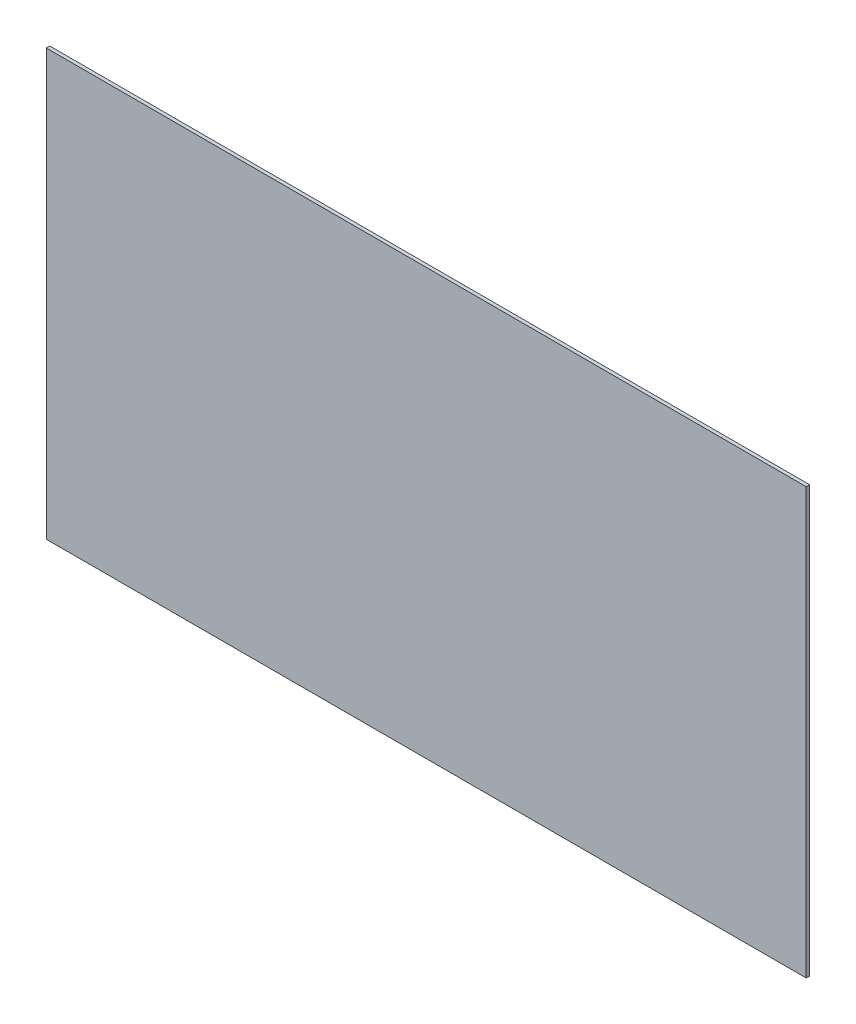
ISO-10303-21;
HEADER;
FILE_DESCRIPTION(('STEP AP214'),'2;1');
FILE_NAME('part.step','',(''),(''),'','','');
FILE_SCHEMA(('AUTOMOTIVE_DESIGN { 1 0 10303 214 1 1 1 1 }'));
ENDSEC;
DATA;
#1=APPLICATION_CONTEXT('core data for automotive mechanical design processes');
#2=APPLICATION_PROTOCOL_DEFINITION('international standard','automotive_design',2000,#1);
#3=PRODUCT_CONTEXT('',#1,'mechanical');
#4=PRODUCT('Part','Part','',(#3));
#5=PRODUCT_RELATED_PRODUCT_CATEGORY('part','',(#4));
#6=PRODUCT_DEFINITION_FORMATION('','',#4);
#7=PRODUCT_DEFINITION_CONTEXT('part definition',#1,'design');
#8=PRODUCT_DEFINITION('design','',#6,#7);
#9=PRODUCT_DEFINITION_SHAPE('','',#8);
#10=(LENGTH_UNIT() NAMED_UNIT(*) SI_UNIT(.MILLI.,.METRE.));
#11=(NAMED_UNIT(*) PLANE_ANGLE_UNIT() SI_UNIT($,.RADIAN.));
#12=(NAMED_UNIT(*) SI_UNIT($,.STERADIAN.) SOLID_ANGLE_UNIT());
#13=UNCERTAINTY_MEASURE_WITH_UNIT(LENGTH_MEASURE(1.E-05),#10,'distance_accuracy_value','');
#14=(GEOMETRIC_REPRESENTATION_CONTEXT(3) GLOBAL_UNCERTAINTY_ASSIGNED_CONTEXT((#13)) GLOBAL_UNIT_ASSIGNED_CONTEXT((#10,
#11,#12)) REPRESENTATION_CONTEXT('',''));
#15=CARTESIAN_POINT('',(0.,0.,0.));
#16=DIRECTION('',(0.,0.,1.));
#17=DIRECTION('',(1.,0.,0.));
#18=AXIS2_PLACEMENT_3D('',#15,#16,#17);
#19=CARTESIAN_POINT('',(0.,0.,0.));
#20=DIRECTION('',(0.,0.,1.));
#21=DIRECTION('',(1.,0.,0.));
#22=AXIS2_PLACEMENT_3D('',#19,#20,#21);
#23=PLANE('',#22);
#24=DIRECTION('',(1.,0.,0.));
#25=VECTOR('',#24,1.);
#26=CARTESIAN_POINT('',(77.44,-43.36,0.));
#27=LINE('',#26,#25);
#28=CARTESIAN_POINT('',(77.44,-43.36,0.));
#29=VERTEX_POINT('',#28);
#30=CARTESIAN_POINT('',(-77.44,-43.36,0.));
#31=VERTEX_POINT('',#30);
#32=EDGE_CURVE('E55',#29,#31,#27,.F.);
#33=ORIENTED_EDGE('',*,*,#32,.F.);
#34=DIRECTION('',(0.,1.,0.));
#35=VECTOR('',#34,1.);
#36=CARTESIAN_POINT('',(77.44,43.36,0.));
#37=LINE('',#36,#35);
#38=CARTESIAN_POINT('',(77.44,43.36,0.));
#39=VERTEX_POINT('',#38);
#40=EDGE_CURVE('E57',#39,#29,#37,.F.);
#41=ORIENTED_EDGE('',*,*,#40,.F.);
#42=DIRECTION('',(1.,0.,0.));
#43=VECTOR('',#42,1.);
#44=CARTESIAN_POINT('',(-77.44,43.36,0.));
#45=LINE('',#44,#43);
#46=CARTESIAN_POINT('',(-77.44,43.36,0.));
#47=VERTEX_POINT('',#46);
#48=EDGE_CURVE('E20',#47,#39,#45,.T.);
#49=ORIENTED_EDGE('',*,*,#48,.F.);
#50=DIRECTION('',(0.,1.,0.));
#51=VECTOR('',#50,1.);
#52=CARTESIAN_POINT('',(-77.44,-43.36,0.));
#53=LINE('',#52,#51);
#54=EDGE_CURVE('E79',#31,#47,#53,.T.);
#55=ORIENTED_EDGE('',*,*,#54,.F.);
#56=EDGE_LOOP('',(#33,#41,#49,#55));
#57=FACE_BOUND('',#56,.T.);
#58=ADVANCED_FACE('F17',(#57),#23,.T.);
#59=CARTESIAN_POINT('',(-77.44,43.36,0.));
#60=DIRECTION('',(0.,1.,0.));
#61=DIRECTION('',(0.,0.,1.));
#62=AXIS2_PLACEMENT_3D('',#59,#60,#61);
#63=PLANE('',#62);
#64=DIRECTION('',(-1.,0.,0.));
#65=VECTOR('',#64,1.);
#66=CARTESIAN_POINT('',(0.,43.36,-0.7));
#67=LINE('',#66,#65);
#68=CARTESIAN_POINT('',(-77.44,43.36,-0.7));
#69=VERTEX_POINT('',#68);
#70=CARTESIAN_POINT('',(77.44,43.36,-0.7));
#71=VERTEX_POINT('',#70);
#72=EDGE_CURVE('E83',#69,#71,#67,.F.);
#73=ORIENTED_EDGE('',*,*,#72,.F.);
#74=DIRECTION('',(0.,0.,1.));
#75=VECTOR('',#74,1.);
#76=CARTESIAN_POINT('',(-77.44,43.36,0.));
#77=LINE('',#76,#75);
#78=EDGE_CURVE('E68',#47,#69,#77,.F.);
#79=ORIENTED_EDGE('',*,*,#78,.F.);
#80=ORIENTED_EDGE('',*,*,#48,.T.);
#81=DIRECTION('',(0.,0.,-1.));
#82=VECTOR('',#81,1.);
#83=CARTESIAN_POINT('',(77.44,43.36,0.));
#84=LINE('',#83,#82);
#85=EDGE_CURVE('E63',#71,#39,#84,.F.);
#86=ORIENTED_EDGE('',*,*,#85,.F.);
#87=EDGE_LOOP('',(#73,#79,#80,#86));
#88=FACE_BOUND('',#87,.T.);
#89=ADVANCED_FACE('F65',(#88),#63,.T.);
#90=CARTESIAN_POINT('',(77.44,43.36,0.));
#91=DIRECTION('',(1.,0.,0.));
#92=DIRECTION('',(0.,0.,-1.));
#93=AXIS2_PLACEMENT_3D('',#90,#91,#92);
#94=PLANE('',#93);
#95=DIRECTION('',(0.,1.,0.));
#96=VECTOR('',#95,1.);
#97=CARTESIAN_POINT('',(77.44,0.,-0.7));
#98=LINE('',#97,#96);
#99=CARTESIAN_POINT('',(77.44,-43.36,-0.7));
#100=VERTEX_POINT('',#99);
#101=EDGE_CURVE('E72',#71,#100,#98,.F.);
#102=ORIENTED_EDGE('',*,*,#101,.F.);
#103=ORIENTED_EDGE('',*,*,#85,.T.);
#104=ORIENTED_EDGE('',*,*,#40,.T.);
#105=DIRECTION('',(0.,0.,-1.));
#106=VECTOR('',#105,1.);
#107=CARTESIAN_POINT('',(77.44,-43.36,0.));
#108=LINE('',#107,#106);
#109=EDGE_CURVE('E75',#100,#29,#108,.F.);
#110=ORIENTED_EDGE('',*,*,#109,.F.);
#111=EDGE_LOOP('',(#102,#103,#104,#110));
#112=FACE_BOUND('',#111,.T.);
#113=ADVANCED_FACE('F70',(#112),#94,.T.);
#114=CARTESIAN_POINT('',(77.44,-43.36,0.));
#115=DIRECTION('',(0.,-1.,0.));
#116=DIRECTION('',(0.,0.,-1.));
#117=AXIS2_PLACEMENT_3D('',#114,#115,#116);
#118=PLANE('',#117);
#119=DIRECTION('',(-1.,0.,0.));
#120=VECTOR('',#119,1.);
#121=CARTESIAN_POINT('',(0.,-43.36,-0.7));
#122=LINE('',#121,#120);
#123=CARTESIAN_POINT('',(-77.44,-43.36,-0.7));
#124=VERTEX_POINT('',#123);
#125=EDGE_CURVE('E26',#100,#124,#122,.T.);
#126=ORIENTED_EDGE('',*,*,#125,.F.);
#127=ORIENTED_EDGE('',*,*,#109,.T.);
#128=ORIENTED_EDGE('',*,*,#32,.T.);
#129=DIRECTION('',(0.,0.,1.));
#130=VECTOR('',#129,1.);
#131=CARTESIAN_POINT('',(-77.44,-43.36,0.));
#132=LINE('',#131,#130);
#133=EDGE_CURVE('E35',#124,#31,#132,.T.);
#134=ORIENTED_EDGE('',*,*,#133,.F.);
#135=EDGE_LOOP('',(#126,#127,#128,#134));
#136=FACE_BOUND('',#135,.T.);
#137=ADVANCED_FACE('F89',(#136),#118,.T.);
#138=CARTESIAN_POINT('',(-77.44,-43.36,0.));
#139=DIRECTION('',(-1.,0.,0.));
#140=DIRECTION('',(0.,0.,1.));
#141=AXIS2_PLACEMENT_3D('',#138,#139,#140);
#142=PLANE('',#141);
#143=DIRECTION('',(0.,1.,0.));
#144=VECTOR('',#143,1.);
#145=CARTESIAN_POINT('',(-77.44,0.,-0.7));
#146=LINE('',#145,#144);
#147=EDGE_CURVE('E11',#124,#69,#146,.T.);
#148=ORIENTED_EDGE('',*,*,#147,.F.);
#149=ORIENTED_EDGE('',*,*,#133,.T.);
#150=ORIENTED_EDGE('',*,*,#54,.T.);
#151=ORIENTED_EDGE('',*,*,#78,.T.);
#152=EDGE_LOOP('',(#148,#149,#150,#151));
#153=FACE_BOUND('',#152,.T.);
#154=ADVANCED_FACE('F91',(#153),#142,.T.);
#155=CARTESIAN_POINT('',(0.,0.,-0.7));
#156=DIRECTION('',(0.,0.,-1.));
#157=DIRECTION('',(-1.,0.,0.));
#158=AXIS2_PLACEMENT_3D('',#155,#156,#157);
#159=PLANE('',#158);
#160=ORIENTED_EDGE('',*,*,#125,.T.);
#161=ORIENTED_EDGE('',*,*,#147,.T.);
#162=ORIENTED_EDGE('',*,*,#72,.T.);
#163=ORIENTED_EDGE('',*,*,#101,.T.);
#164=EDGE_LOOP('',(#160,#161,#162,#163));
#165=FACE_BOUND('',#164,.T.);
#166=ADVANCED_FACE('F88',(#165),#159,.T.);
#167=CLOSED_SHELL('',(#58,#89,#113,#137,#154,#166));
#168=MANIFOLD_SOLID_BREP('B1',#167);
#169=ADVANCED_BREP_SHAPE_REPRESENTATION('',(#18,#168),#14);
#170=SHAPE_DEFINITION_REPRESENTATION(#9,#169);
ENDSEC;
END-ISO-10303-21;
